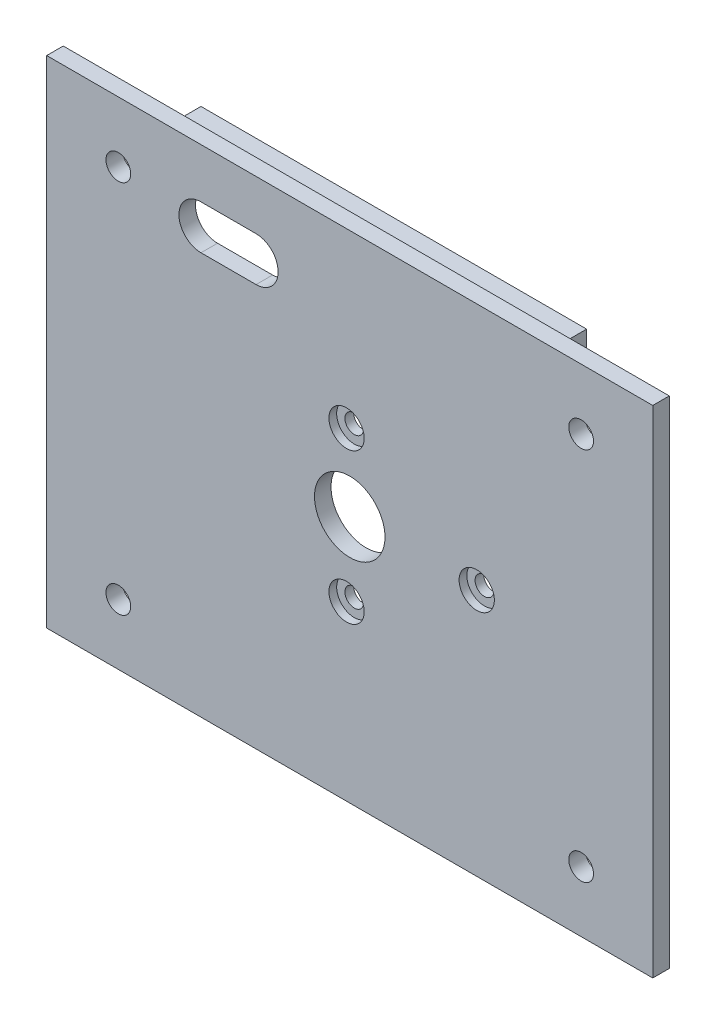
ISO-10303-21;
HEADER;
FILE_DESCRIPTION(('STEP AP214'),'2;1');
FILE_NAME('part.step','',(''),(''),'','','');
FILE_SCHEMA(('AUTOMOTIVE_DESIGN { 1 0 10303 214 1 1 1 1 }'));
ENDSEC;
DATA;
#1=APPLICATION_CONTEXT('core data for automotive mechanical design processes');
#2=APPLICATION_PROTOCOL_DEFINITION('international standard','automotive_design',2000,#1);
#3=PRODUCT_CONTEXT('',#1,'mechanical');
#4=PRODUCT('Part','Part','',(#3));
#5=PRODUCT_RELATED_PRODUCT_CATEGORY('part','',(#4));
#6=PRODUCT_DEFINITION_FORMATION('','',#4);
#7=PRODUCT_DEFINITION_CONTEXT('part definition',#1,'design');
#8=PRODUCT_DEFINITION('design','',#6,#7);
#9=PRODUCT_DEFINITION_SHAPE('','',#8);
#10=(LENGTH_UNIT() NAMED_UNIT(*) SI_UNIT(.MILLI.,.METRE.));
#11=(NAMED_UNIT(*) PLANE_ANGLE_UNIT() SI_UNIT($,.RADIAN.));
#12=(NAMED_UNIT(*) SI_UNIT($,.STERADIAN.) SOLID_ANGLE_UNIT());
#13=UNCERTAINTY_MEASURE_WITH_UNIT(LENGTH_MEASURE(1.E-05),#10,'distance_accuracy_value','');
#14=(GEOMETRIC_REPRESENTATION_CONTEXT(3) GLOBAL_UNCERTAINTY_ASSIGNED_CONTEXT((#13)) GLOBAL_UNIT_ASSIGNED_CONTEXT((#10,
#11,#12)) REPRESENTATION_CONTEXT('',''));
#15=CARTESIAN_POINT('',(0.,0.,0.));
#16=DIRECTION('',(0.,0.,1.));
#17=DIRECTION('',(1.,0.,0.));
#18=AXIS2_PLACEMENT_3D('',#15,#16,#17);
#19=CARTESIAN_POINT('',(-35.,40.,89.));
#20=DIRECTION('',(0.,0.,1.));
#21=DIRECTION('',(1.,0.,0.));
#22=AXIS2_PLACEMENT_3D('',#19,#20,#21);
#23=PLANE('',#22);
#24=DIRECTION('',(1.,0.,0.));
#25=VECTOR('',#24,1.);
#26=CARTESIAN_POINT('',(-35.,43.,89.));
#27=LINE('',#26,#25);
#28=CARTESIAN_POINT('',(-35.,43.,89.));
#29=VERTEX_POINT('',#28);
#30=CARTESIAN_POINT('',(35.,43.,89.));
#31=VERTEX_POINT('',#30);
#32=EDGE_CURVE('E174',#29,#31,#27,.T.);
#33=ORIENTED_EDGE('',*,*,#32,.T.);
#34=DIRECTION('',(0.,1.,0.));
#35=VECTOR('',#34,1.);
#36=CARTESIAN_POINT('',(35.,40.,89.));
#37=LINE('',#36,#35);
#38=CARTESIAN_POINT('',(35.,40.,89.));
#39=VERTEX_POINT('',#38);
#40=EDGE_CURVE('E11',#39,#31,#37,.T.);
#41=ORIENTED_EDGE('',*,*,#40,.F.);
#42=DIRECTION('',(1.,0.,0.));
#43=VECTOR('',#42,1.);
#44=CARTESIAN_POINT('',(-35.,40.,89.));
#45=LINE('',#44,#43);
#46=CARTESIAN_POINT('',(-35.,40.,89.));
#47=VERTEX_POINT('',#46);
#48=EDGE_CURVE('E20',#47,#39,#45,.T.);
#49=ORIENTED_EDGE('',*,*,#48,.F.);
#50=DIRECTION('',(0.,1.,0.));
#51=VECTOR('',#50,1.);
#52=CARTESIAN_POINT('',(-35.,40.,89.));
#53=LINE('',#52,#51);
#54=EDGE_CURVE('E186',#47,#29,#53,.T.);
#55=ORIENTED_EDGE('',*,*,#54,.T.);
#56=EDGE_LOOP('',(#33,#41,#49,#55));
#57=FACE_BOUND('',#56,.T.);
#58=ADVANCED_FACE('F17',(#57),#23,.F.);
#59=CARTESIAN_POINT('',(-35.,-43.,89.));
#60=DIRECTION('',(0.,0.,1.));
#61=DIRECTION('',(1.,0.,0.));
#62=AXIS2_PLACEMENT_3D('',#59,#60,#61);
#63=PLANE('',#62);
#64=DIRECTION('',(1.,0.,0.));
#65=VECTOR('',#64,1.);
#66=CARTESIAN_POINT('',(-35.,-40.,89.));
#67=LINE('',#66,#65);
#68=CARTESIAN_POINT('',(-35.,-40.,89.));
#69=VERTEX_POINT('',#68);
#70=CARTESIAN_POINT('',(35.,-40.,89.));
#71=VERTEX_POINT('',#70);
#72=EDGE_CURVE('E339',#69,#71,#67,.T.);
#73=ORIENTED_EDGE('',*,*,#72,.T.);
#74=DIRECTION('',(0.,1.,0.));
#75=VECTOR('',#74,1.);
#76=CARTESIAN_POINT('',(35.,-43.,89.));
#77=LINE('',#76,#75);
#78=CARTESIAN_POINT('',(35.,-43.,89.));
#79=VERTEX_POINT('',#78);
#80=EDGE_CURVE('E221',#79,#71,#77,.T.);
#81=ORIENTED_EDGE('',*,*,#80,.F.);
#82=DIRECTION('',(1.,0.,0.));
#83=VECTOR('',#82,1.);
#84=CARTESIAN_POINT('',(-35.,-43.,89.));
#85=LINE('',#84,#83);
#86=CARTESIAN_POINT('',(-35.,-43.,89.));
#87=VERTEX_POINT('',#86);
#88=EDGE_CURVE('E224',#87,#79,#85,.T.);
#89=ORIENTED_EDGE('',*,*,#88,.F.);
#90=DIRECTION('',(0.,1.,0.));
#91=VECTOR('',#90,1.);
#92=CARTESIAN_POINT('',(-35.,-43.,89.));
#93=LINE('',#92,#91);
#94=EDGE_CURVE('E317',#87,#69,#93,.T.);
#95=ORIENTED_EDGE('',*,*,#94,.T.);
#96=EDGE_LOOP('',(#73,#81,#89,#95));
#97=FACE_BOUND('',#96,.T.);
#98=ADVANCED_FACE('F561',(#97),#63,.F.);
#99=CARTESIAN_POINT('',(23.05,0.,95.6));
#100=DIRECTION('',(0.,0.,1.));
#101=DIRECTION('',(1.,0.,0.));
#102=AXIS2_PLACEMENT_3D('',#99,#100,#101);
#103=PLANE('',#102);
#104=CARTESIAN_POINT('',(23.05,0.,95.6));
#105=DIRECTION('',(0.,0.,1.));
#106=DIRECTION('',(1.,0.,0.));
#107=AXIS2_PLACEMENT_3D('',#104,#105,#106);
#108=CIRCLE('',#107,1.7);
#109=CARTESIAN_POINT('',(24.75,0.,95.6));
#110=VERTEX_POINT('',#109);
#111=EDGE_CURVE('E196',#110,#110,#108,.T.);
#112=ORIENTED_EDGE('',*,*,#111,.F.);
#113=EDGE_LOOP('',(#112));
#114=FACE_BOUND('',#113,.T.);
#115=CARTESIAN_POINT('',(23.05,0.,95.6));
#116=DIRECTION('',(0.,0.,1.));
#117=DIRECTION('',(1.,0.,0.));
#118=AXIS2_PLACEMENT_3D('',#115,#116,#117);
#119=CIRCLE('',#118,3.2);
#120=CARTESIAN_POINT('',(26.25,0.,95.6));
#121=VERTEX_POINT('',#120);
#122=EDGE_CURVE('E368',#121,#121,#119,.T.);
#123=ORIENTED_EDGE('',*,*,#122,.T.);
#124=EDGE_LOOP('',(#123));
#125=FACE_BOUND('',#124,.T.);
#126=ADVANCED_FACE('F464',(#114,#125),#103,.T.);
#127=CARTESIAN_POINT('',(-0.575,13.6399,95.6));
#128=DIRECTION('',(0.,0.,1.));
#129=DIRECTION('',(1.,0.,0.));
#130=AXIS2_PLACEMENT_3D('',#127,#128,#129);
#131=PLANE('',#130);
#132=CARTESIAN_POINT('',(-0.575,13.6399,95.6));
#133=DIRECTION('',(0.,0.,1.));
#134=DIRECTION('',(1.,0.,0.));
#135=AXIS2_PLACEMENT_3D('',#132,#133,#134);
#136=CIRCLE('',#135,1.7);
#137=CARTESIAN_POINT('',(1.125,13.6399,95.6));
#138=VERTEX_POINT('',#137);
#139=EDGE_CURVE('E405',#138,#138,#136,.T.);
#140=ORIENTED_EDGE('',*,*,#139,.F.);
#141=EDGE_LOOP('',(#140));
#142=FACE_BOUND('',#141,.T.);
#143=CARTESIAN_POINT('',(-0.575,13.6399,95.6));
#144=DIRECTION('',(0.,0.,1.));
#145=DIRECTION('',(1.,0.,0.));
#146=AXIS2_PLACEMENT_3D('',#143,#144,#145);
#147=CIRCLE('',#146,3.2);
#148=CARTESIAN_POINT('',(2.625,13.6399,95.6));
#149=VERTEX_POINT('',#148);
#150=EDGE_CURVE('E276',#149,#149,#147,.T.);
#151=ORIENTED_EDGE('',*,*,#150,.T.);
#152=EDGE_LOOP('',(#151));
#153=FACE_BOUND('',#152,.T.);
#154=ADVANCED_FACE('F460',(#142,#153),#131,.T.);
#155=CARTESIAN_POINT('',(-0.575,-13.6399,95.6));
#156=DIRECTION('',(0.,0.,1.));
#157=DIRECTION('',(1.,0.,0.));
#158=AXIS2_PLACEMENT_3D('',#155,#156,#157);
#159=PLANE('',#158);
#160=CARTESIAN_POINT('',(-0.575,-13.6399,95.6));
#161=DIRECTION('',(0.,0.,1.));
#162=DIRECTION('',(1.,0.,0.));
#163=AXIS2_PLACEMENT_3D('',#160,#161,#162);
#164=CIRCLE('',#163,1.7);
#165=CARTESIAN_POINT('',(1.125,-13.6399,95.6));
#166=VERTEX_POINT('',#165);
#167=EDGE_CURVE('E304',#166,#166,#164,.T.);
#168=ORIENTED_EDGE('',*,*,#167,.F.);
#169=EDGE_LOOP('',(#168));
#170=FACE_BOUND('',#169,.T.);
#171=CARTESIAN_POINT('',(-0.575,-13.6399,95.6));
#172=DIRECTION('',(0.,0.,1.));
#173=DIRECTION('',(1.,0.,0.));
#174=AXIS2_PLACEMENT_3D('',#171,#172,#173);
#175=CIRCLE('',#174,3.2);
#176=CARTESIAN_POINT('',(2.625,-13.6399,95.6));
#177=VERTEX_POINT('',#176);
#178=EDGE_CURVE('E417',#177,#177,#175,.T.);
#179=ORIENTED_EDGE('',*,*,#178,.T.);
#180=EDGE_LOOP('',(#179));
#181=FACE_BOUND('',#180,.T.);
#182=ADVANCED_FACE('F463',(#170,#181),#159,.T.);
#183=CARTESIAN_POINT('',(35.,40.,89.));
#184=DIRECTION('',(1.,0.,0.));
#185=DIRECTION('',(0.,1.,0.));
#186=AXIS2_PLACEMENT_3D('',#183,#184,#185);
#187=PLANE('',#186);
#188=DIRECTION('',(0.,0.,1.));
#189=VECTOR('',#188,1.);
#190=CARTESIAN_POINT('',(35.,40.,89.));
#191=LINE('',#190,#189);
#192=CARTESIAN_POINT('',(35.,40.,94.));
#193=VERTEX_POINT('',#192);
#194=EDGE_CURVE('E205',#39,#193,#191,.T.);
#195=ORIENTED_EDGE('',*,*,#194,.F.);
#196=ORIENTED_EDGE('',*,*,#40,.T.);
#197=DIRECTION('',(0.,0.,1.));
#198=VECTOR('',#197,1.);
#199=CARTESIAN_POINT('',(35.,43.,89.));
#200=LINE('',#199,#198);
#201=CARTESIAN_POINT('',(35.,43.,94.));
#202=VERTEX_POINT('',#201);
#203=EDGE_CURVE('E181',#31,#202,#200,.T.);
#204=ORIENTED_EDGE('',*,*,#203,.T.);
#205=DIRECTION('',(0.,1.,0.));
#206=VECTOR('',#205,1.);
#207=CARTESIAN_POINT('',(35.,40.,94.));
#208=LINE('',#207,#206);
#209=EDGE_CURVE('E349',#193,#202,#208,.T.);
#210=ORIENTED_EDGE('',*,*,#209,.F.);
#211=EDGE_LOOP('',(#195,#196,#204,#210));
#212=FACE_BOUND('',#211,.T.);
#213=ADVANCED_FACE('F655',(#212),#187,.T.);
#214=CARTESIAN_POINT('',(-35.,40.,89.));
#215=DIRECTION('',(0.,1.,0.));
#216=DIRECTION('',(1.,0.,0.));
#217=AXIS2_PLACEMENT_3D('',#214,#215,#216);
#218=PLANE('',#217);
#219=ORIENTED_EDGE('',*,*,#194,.T.);
#220=DIRECTION('',(1.,0.,0.));
#221=VECTOR('',#220,1.);
#222=CARTESIAN_POINT('',(-35.,40.,94.));
#223=LINE('',#222,#221);
#224=CARTESIAN_POINT('',(-35.,40.,94.));
#225=VERTEX_POINT('',#224);
#226=EDGE_CURVE('E354',#225,#193,#223,.T.);
#227=ORIENTED_EDGE('',*,*,#226,.F.);
#228=DIRECTION('',(0.,0.,1.));
#229=VECTOR('',#228,1.);
#230=CARTESIAN_POINT('',(-35.,40.,89.));
#231=LINE('',#230,#229);
#232=EDGE_CURVE('E183',#47,#225,#231,.T.);
#233=ORIENTED_EDGE('',*,*,#232,.F.);
#234=ORIENTED_EDGE('',*,*,#48,.T.);
#235=EDGE_LOOP('',(#219,#227,#233,#234));
#236=FACE_BOUND('',#235,.T.);
#237=ADVANCED_FACE('F659',(#236),#218,.F.);
#238=CARTESIAN_POINT('',(-35.,43.,89.));
#239=DIRECTION('',(0.,1.,0.));
#240=DIRECTION('',(1.,0.,0.));
#241=AXIS2_PLACEMENT_3D('',#238,#239,#240);
#242=PLANE('',#241);
#243=ORIENTED_EDGE('',*,*,#32,.F.);
#244=DIRECTION('',(0.,0.,1.));
#245=VECTOR('',#244,1.);
#246=CARTESIAN_POINT('',(-35.,43.,89.));
#247=LINE('',#246,#245);
#248=CARTESIAN_POINT('',(-35.,43.,94.));
#249=VERTEX_POINT('',#248);
#250=EDGE_CURVE('E179',#29,#249,#247,.T.);
#251=ORIENTED_EDGE('',*,*,#250,.T.);
#252=DIRECTION('',(1.,0.,0.));
#253=VECTOR('',#252,1.);
#254=CARTESIAN_POINT('',(-35.,43.,94.));
#255=LINE('',#254,#253);
#256=EDGE_CURVE('E353',#249,#202,#255,.T.);
#257=ORIENTED_EDGE('',*,*,#256,.T.);
#258=ORIENTED_EDGE('',*,*,#203,.F.);
#259=EDGE_LOOP('',(#243,#251,#257,#258));
#260=FACE_BOUND('',#259,.T.);
#261=ADVANCED_FACE('F176',(#260),#242,.T.);
#262=CARTESIAN_POINT('',(-35.,40.,89.));
#263=DIRECTION('',(1.,0.,0.));
#264=DIRECTION('',(0.,1.,0.));
#265=AXIS2_PLACEMENT_3D('',#262,#263,#264);
#266=PLANE('',#265);
#267=DIRECTION('',(0.,1.,0.));
#268=VECTOR('',#267,1.);
#269=CARTESIAN_POINT('',(-35.,40.,94.));
#270=LINE('',#269,#268);
#271=EDGE_CURVE('E193',#225,#249,#270,.T.);
#272=ORIENTED_EDGE('',*,*,#271,.T.);
#273=ORIENTED_EDGE('',*,*,#250,.F.);
#274=ORIENTED_EDGE('',*,*,#54,.F.);
#275=ORIENTED_EDGE('',*,*,#232,.T.);
#276=EDGE_LOOP('',(#272,#273,#274,#275));
#277=FACE_BOUND('',#276,.T.);
#278=ADVANCED_FACE('F191',(#277),#266,.F.);
#279=CARTESIAN_POINT('',(23.05,0.,93.));
#280=DIRECTION('',(0.,0.,1.));
#281=DIRECTION('',(1.,0.,0.));
#282=AXIS2_PLACEMENT_3D('',#279,#280,#281);
#283=CYLINDRICAL_SURFACE('',#282,1.7);
#284=DIRECTION('',(0.,0.,1.));
#285=VECTOR('',#284,1.);
#286=CARTESIAN_POINT('',(24.75,0.,93.));
#287=LINE('',#286,#285);
#288=CARTESIAN_POINT('',(24.75,0.,94.));
#289=VERTEX_POINT('',#288);
#290=EDGE_CURVE('E200',#289,#110,#287,.T.);
#291=ORIENTED_EDGE('',*,*,#290,.F.);
#292=CARTESIAN_POINT('',(23.05,0.,94.));
#293=DIRECTION('',(0.,0.,1.));
#294=DIRECTION('',(1.,0.,0.));
#295=AXIS2_PLACEMENT_3D('',#292,#293,#294);
#296=CIRCLE('',#295,1.7);
#297=EDGE_CURVE('E390',#289,#289,#296,.T.);
#298=ORIENTED_EDGE('',*,*,#297,.F.);
#299=ORIENTED_EDGE('',*,*,#290,.T.);
#300=ORIENTED_EDGE('',*,*,#111,.T.);
#301=EDGE_LOOP('',(#291,#298,#299,#300));
#302=FACE_BOUND('',#301,.T.);
#303=ADVANCED_FACE('F662',(#302),#283,.F.);
#304=CARTESIAN_POINT('',(-0.575,13.6399,93.));
#305=DIRECTION('',(0.,0.,1.));
#306=DIRECTION('',(1.,0.,0.));
#307=AXIS2_PLACEMENT_3D('',#304,#305,#306);
#308=CYLINDRICAL_SURFACE('',#307,1.7);
#309=DIRECTION('',(0.,0.,1.));
#310=VECTOR('',#309,1.);
#311=CARTESIAN_POINT('',(1.125,13.6399,93.));
#312=LINE('',#311,#310);
#313=CARTESIAN_POINT('',(1.125,13.6399,94.));
#314=VERTEX_POINT('',#313);
#315=EDGE_CURVE('E223',#314,#138,#312,.T.);
#316=ORIENTED_EDGE('',*,*,#315,.F.);
#317=CARTESIAN_POINT('',(-0.575,13.6399,94.));
#318=DIRECTION('',(0.,0.,1.));
#319=DIRECTION('',(1.,0.,0.));
#320=AXIS2_PLACEMENT_3D('',#317,#318,#319);
#321=CIRCLE('',#320,1.7);
#322=EDGE_CURVE('E364',#314,#314,#321,.T.);
#323=ORIENTED_EDGE('',*,*,#322,.F.);
#324=ORIENTED_EDGE('',*,*,#315,.T.);
#325=ORIENTED_EDGE('',*,*,#139,.T.);
#326=EDGE_LOOP('',(#316,#323,#324,#325));
#327=FACE_BOUND('',#326,.T.);
#328=ADVANCED_FACE('F457',(#327),#308,.F.);
#329=CARTESIAN_POINT('',(35.,-43.,89.));
#330=DIRECTION('',(1.,0.,0.));
#331=DIRECTION('',(0.,1.,0.));
#332=AXIS2_PLACEMENT_3D('',#329,#330,#331);
#333=PLANE('',#332);
#334=DIRECTION('',(0.,0.,1.));
#335=VECTOR('',#334,1.);
#336=CARTESIAN_POINT('',(35.,-43.,89.));
#337=LINE('',#336,#335);
#338=CARTESIAN_POINT('',(35.,-43.,94.));
#339=VERTEX_POINT('',#338);
#340=EDGE_CURVE('E338',#79,#339,#337,.T.);
#341=ORIENTED_EDGE('',*,*,#340,.F.);
#342=ORIENTED_EDGE('',*,*,#80,.T.);
#343=DIRECTION('',(0.,0.,1.));
#344=VECTOR('',#343,1.);
#345=CARTESIAN_POINT('',(35.,-40.,89.));
#346=LINE('',#345,#344);
#347=CARTESIAN_POINT('',(35.,-40.,94.));
#348=VERTEX_POINT('',#347);
#349=EDGE_CURVE('E335',#71,#348,#346,.T.);
#350=ORIENTED_EDGE('',*,*,#349,.T.);
#351=DIRECTION('',(0.,1.,0.));
#352=VECTOR('',#351,1.);
#353=CARTESIAN_POINT('',(35.,-43.,94.));
#354=LINE('',#353,#352);
#355=EDGE_CURVE('E334',#339,#348,#354,.T.);
#356=ORIENTED_EDGE('',*,*,#355,.F.);
#357=EDGE_LOOP('',(#341,#342,#350,#356));
#358=FACE_BOUND('',#357,.T.);
#359=ADVANCED_FACE('F546',(#358),#333,.T.);
#360=CARTESIAN_POINT('',(-35.,-43.,89.));
#361=DIRECTION('',(0.,1.,0.));
#362=DIRECTION('',(1.,0.,0.));
#363=AXIS2_PLACEMENT_3D('',#360,#361,#362);
#364=PLANE('',#363);
#365=ORIENTED_EDGE('',*,*,#340,.T.);
#366=DIRECTION('',(1.,0.,0.));
#367=VECTOR('',#366,1.);
#368=CARTESIAN_POINT('',(-35.,-43.,94.));
#369=LINE('',#368,#367);
#370=CARTESIAN_POINT('',(-35.,-43.,94.));
#371=VERTEX_POINT('',#370);
#372=EDGE_CURVE('E326',#371,#339,#369,.T.);
#373=ORIENTED_EDGE('',*,*,#372,.F.);
#374=DIRECTION('',(0.,0.,1.));
#375=VECTOR('',#374,1.);
#376=CARTESIAN_POINT('',(-35.,-43.,89.));
#377=LINE('',#376,#375);
#378=EDGE_CURVE('E321',#87,#371,#377,.T.);
#379=ORIENTED_EDGE('',*,*,#378,.F.);
#380=ORIENTED_EDGE('',*,*,#88,.T.);
#381=EDGE_LOOP('',(#365,#373,#379,#380));
#382=FACE_BOUND('',#381,.T.);
#383=ADVANCED_FACE('F558',(#382),#364,.F.);
#384=CARTESIAN_POINT('',(-35.,-40.,89.));
#385=DIRECTION('',(0.,1.,0.));
#386=DIRECTION('',(1.,0.,0.));
#387=AXIS2_PLACEMENT_3D('',#384,#385,#386);
#388=PLANE('',#387);
#389=ORIENTED_EDGE('',*,*,#72,.F.);
#390=DIRECTION('',(0.,0.,1.));
#391=VECTOR('',#390,1.);
#392=CARTESIAN_POINT('',(-35.,-40.,89.));
#393=LINE('',#392,#391);
#394=CARTESIAN_POINT('',(-35.,-40.,94.));
#395=VERTEX_POINT('',#394);
#396=EDGE_CURVE('E322',#69,#395,#393,.T.);
#397=ORIENTED_EDGE('',*,*,#396,.T.);
#398=DIRECTION('',(1.,0.,0.));
#399=VECTOR('',#398,1.);
#400=CARTESIAN_POINT('',(-35.,-40.,94.));
#401=LINE('',#400,#399);
#402=EDGE_CURVE('E340',#395,#348,#401,.T.);
#403=ORIENTED_EDGE('',*,*,#402,.T.);
#404=ORIENTED_EDGE('',*,*,#349,.F.);
#405=EDGE_LOOP('',(#389,#397,#403,#404));
#406=FACE_BOUND('',#405,.T.);
#407=ADVANCED_FACE('F549',(#406),#388,.T.);
#408=CARTESIAN_POINT('',(-35.,-43.,89.));
#409=DIRECTION('',(1.,0.,0.));
#410=DIRECTION('',(0.,1.,0.));
#411=AXIS2_PLACEMENT_3D('',#408,#409,#410);
#412=PLANE('',#411);
#413=DIRECTION('',(0.,1.,0.));
#414=VECTOR('',#413,1.);
#415=CARTESIAN_POINT('',(-35.,-43.,94.));
#416=LINE('',#415,#414);
#417=EDGE_CURVE('E344',#371,#395,#416,.T.);
#418=ORIENTED_EDGE('',*,*,#417,.T.);
#419=ORIENTED_EDGE('',*,*,#396,.F.);
#420=ORIENTED_EDGE('',*,*,#94,.F.);
#421=ORIENTED_EDGE('',*,*,#378,.T.);
#422=EDGE_LOOP('',(#418,#419,#420,#421));
#423=FACE_BOUND('',#422,.T.);
#424=ADVANCED_FACE('F555',(#423),#412,.F.);
#425=CARTESIAN_POINT('',(-0.575,-13.6399,93.));
#426=DIRECTION('',(0.,0.,1.));
#427=DIRECTION('',(1.,0.,0.));
#428=AXIS2_PLACEMENT_3D('',#425,#426,#427);
#429=CYLINDRICAL_SURFACE('',#428,1.7);
#430=DIRECTION('',(0.,0.,1.));
#431=VECTOR('',#430,1.);
#432=CARTESIAN_POINT('',(1.125,-13.6399,93.));
#433=LINE('',#432,#431);
#434=CARTESIAN_POINT('',(1.125,-13.6399,94.));
#435=VERTEX_POINT('',#434);
#436=EDGE_CURVE('E300',#435,#166,#433,.T.);
#437=ORIENTED_EDGE('',*,*,#436,.F.);
#438=CARTESIAN_POINT('',(-0.575,-13.6399,94.));
#439=DIRECTION('',(0.,0.,1.));
#440=DIRECTION('',(1.,0.,0.));
#441=AXIS2_PLACEMENT_3D('',#438,#439,#440);
#442=CIRCLE('',#441,1.7);
#443=EDGE_CURVE('E316',#435,#435,#442,.T.);
#444=ORIENTED_EDGE('',*,*,#443,.F.);
#445=ORIENTED_EDGE('',*,*,#436,.T.);
#446=ORIENTED_EDGE('',*,*,#167,.T.);
#447=EDGE_LOOP('',(#437,#444,#445,#446));
#448=FACE_BOUND('',#447,.T.);
#449=ADVANCED_FACE('F674',(#448),#429,.F.);
#450=CARTESIAN_POINT('',(42.,34.,93.));
#451=DIRECTION('',(0.,0.,1.));
#452=DIRECTION('',(1.,0.,0.));
#453=AXIS2_PLACEMENT_3D('',#450,#451,#452);
#454=CYLINDRICAL_SURFACE('',#453,2.25);
#455=DIRECTION('',(0.,0.,1.));
#456=VECTOR('',#455,1.);
#457=CARTESIAN_POINT('',(44.25,34.,93.));
#458=LINE('',#457,#456);
#459=CARTESIAN_POINT('',(44.25,34.,94.));
#460=VERTEX_POINT('',#459);
#461=CARTESIAN_POINT('',(44.25,34.,97.));
#462=VERTEX_POINT('',#461);
#463=EDGE_CURVE('E305',#460,#462,#458,.T.);
#464=ORIENTED_EDGE('',*,*,#463,.F.);
#465=CARTESIAN_POINT('',(42.,34.,94.));
#466=DIRECTION('',(0.,0.,1.));
#467=DIRECTION('',(1.,0.,0.));
#468=AXIS2_PLACEMENT_3D('',#465,#466,#467);
#469=CIRCLE('',#468,2.25);
#470=EDGE_CURVE('E408',#460,#460,#469,.T.);
#471=ORIENTED_EDGE('',*,*,#470,.F.);
#472=ORIENTED_EDGE('',*,*,#463,.T.);
#473=CARTESIAN_POINT('',(42.,34.,97.));
#474=DIRECTION('',(0.,0.,1.));
#475=DIRECTION('',(1.,0.,0.));
#476=AXIS2_PLACEMENT_3D('',#473,#474,#475);
#477=CIRCLE('',#476,2.25);
#478=EDGE_CURVE('E231',#462,#462,#477,.T.);
#479=ORIENTED_EDGE('',*,*,#478,.T.);
#480=EDGE_LOOP('',(#464,#471,#472,#479));
#481=FACE_BOUND('',#480,.T.);
#482=ADVANCED_FACE('F677',(#481),#454,.F.);
#483=CARTESIAN_POINT('',(23.05,0.,95.6));
#484=DIRECTION('',(0.,0.,1.));
#485=DIRECTION('',(1.,0.,0.));
#486=AXIS2_PLACEMENT_3D('',#483,#484,#485);
#487=CYLINDRICAL_SURFACE('',#486,3.2);
#488=DIRECTION('',(0.,0.,1.));
#489=VECTOR('',#488,1.);
#490=CARTESIAN_POINT('',(26.25,0.,95.6));
#491=LINE('',#490,#489);
#492=CARTESIAN_POINT('',(26.25,0.,97.));
#493=VERTEX_POINT('',#492);
#494=EDGE_CURVE('E371',#121,#493,#491,.T.);
#495=ORIENTED_EDGE('',*,*,#494,.F.);
#496=ORIENTED_EDGE('',*,*,#122,.F.);
#497=ORIENTED_EDGE('',*,*,#494,.T.);
#498=CARTESIAN_POINT('',(23.05,0.,97.));
#499=DIRECTION('',(0.,0.,1.));
#500=DIRECTION('',(1.,0.,0.));
#501=AXIS2_PLACEMENT_3D('',#498,#499,#500);
#502=CIRCLE('',#501,3.2);
#503=EDGE_CURVE('E236',#493,#493,#502,.T.);
#504=ORIENTED_EDGE('',*,*,#503,.T.);
#505=EDGE_LOOP('',(#495,#496,#497,#504));
#506=FACE_BOUND('',#505,.T.);
#507=ADVANCED_FACE('F681',(#506),#487,.F.);
#508=CARTESIAN_POINT('',(0.,0.,93.));
#509=DIRECTION('',(0.,0.,1.));
#510=DIRECTION('',(1.,0.,0.));
#511=AXIS2_PLACEMENT_3D('',#508,#509,#510);
#512=CYLINDRICAL_SURFACE('',#511,6.4);
#513=DIRECTION('',(0.,0.,1.));
#514=VECTOR('',#513,1.);
#515=CARTESIAN_POINT('',(6.4,0.,93.));
#516=LINE('',#515,#514);
#517=CARTESIAN_POINT('',(6.4,0.,94.));
#518=VERTEX_POINT('',#517);
#519=CARTESIAN_POINT('',(6.4,0.,97.));
#520=VERTEX_POINT('',#519);
#521=EDGE_CURVE('E245',#518,#520,#516,.T.);
#522=ORIENTED_EDGE('',*,*,#521,.F.);
#523=CARTESIAN_POINT('',(0.,0.,94.));
#524=DIRECTION('',(0.,0.,1.));
#525=DIRECTION('',(1.,0.,0.));
#526=AXIS2_PLACEMENT_3D('',#523,#524,#525);
#527=CIRCLE('',#526,6.4);
#528=EDGE_CURVE('E386',#518,#518,#527,.T.);
#529=ORIENTED_EDGE('',*,*,#528,.F.);
#530=ORIENTED_EDGE('',*,*,#521,.T.);
#531=CARTESIAN_POINT('',(0.,0.,97.));
#532=DIRECTION('',(0.,0.,1.));
#533=DIRECTION('',(1.,0.,0.));
#534=AXIS2_PLACEMENT_3D('',#531,#532,#533);
#535=CIRCLE('',#534,6.4);
#536=EDGE_CURVE('E289',#520,#520,#535,.T.);
#537=ORIENTED_EDGE('',*,*,#536,.T.);
#538=EDGE_LOOP('',(#522,#529,#530,#537));
#539=FACE_BOUND('',#538,.T.);
#540=ADVANCED_FACE('F686',(#539),#512,.F.);
#541=CARTESIAN_POINT('',(-17.,32.,92.));
#542=DIRECTION('',(0.,0.,-1.));
#543=DIRECTION('',(0.,1.,0.));
#544=AXIS2_PLACEMENT_3D('',#541,#542,#543);
#545=CYLINDRICAL_SURFACE('',#544,4.);
#546=DIRECTION('',(0.,0.,1.));
#547=VECTOR('',#546,1.);
#548=CARTESIAN_POINT('',(-17.,28.,92.));
#549=LINE('',#548,#547);
#550=CARTESIAN_POINT('',(-17.,28.,94.));
#551=VERTEX_POINT('',#550);
#552=CARTESIAN_POINT('',(-17.,28.,97.));
#553=VERTEX_POINT('',#552);
#554=EDGE_CURVE('E241',#551,#553,#549,.T.);
#555=ORIENTED_EDGE('',*,*,#554,.T.);
#556=CARTESIAN_POINT('',(-17.,32.,97.));
#557=DIRECTION('',(0.,0.,-1.));
#558=DIRECTION('',(0.,1.,0.));
#559=AXIS2_PLACEMENT_3D('',#556,#557,#558);
#560=CIRCLE('',#559,4.);
#561=CARTESIAN_POINT('',(-17.,36.,97.));
#562=VERTEX_POINT('',#561);
#563=EDGE_CURVE('E271',#562,#553,#560,.T.);
#564=ORIENTED_EDGE('',*,*,#563,.F.);
#565=DIRECTION('',(0.,0.,1.));
#566=VECTOR('',#565,1.);
#567=CARTESIAN_POINT('',(-17.,36.,92.));
#568=LINE('',#567,#566);
#569=CARTESIAN_POINT('',(-17.,36.,94.));
#570=VERTEX_POINT('',#569);
#571=EDGE_CURVE('E428',#570,#562,#568,.T.);
#572=ORIENTED_EDGE('',*,*,#571,.F.);
#573=CARTESIAN_POINT('',(-17.,32.,94.));
#574=DIRECTION('',(0.,0.,-1.));
#575=DIRECTION('',(0.,1.,0.));
#576=AXIS2_PLACEMENT_3D('',#573,#574,#575);
#577=CIRCLE('',#576,4.);
#578=EDGE_CURVE('E378',#570,#551,#577,.T.);
#579=ORIENTED_EDGE('',*,*,#578,.T.);
#580=EDGE_LOOP('',(#555,#564,#572,#579));
#581=FACE_BOUND('',#580,.T.);
#582=ADVANCED_FACE('F614',(#581),#545,.F.);
#583=CARTESIAN_POINT('',(-17.,28.,92.));
#584=DIRECTION('',(0.,-1.,0.));
#585=DIRECTION('',(0.,0.,-1.));
#586=AXIS2_PLACEMENT_3D('',#583,#584,#585);
#587=PLANE('',#586);
#588=DIRECTION('',(0.,0.,1.));
#589=VECTOR('',#588,1.);
#590=CARTESIAN_POINT('',(-27.,28.,92.));
#591=LINE('',#590,#589);
#592=CARTESIAN_POINT('',(-27.,28.,94.));
#593=VERTEX_POINT('',#592);
#594=CARTESIAN_POINT('',(-27.,28.,97.));
#595=VERTEX_POINT('',#594);
#596=EDGE_CURVE('E246',#593,#595,#591,.T.);
#597=ORIENTED_EDGE('',*,*,#596,.T.);
#598=DIRECTION('',(1.,0.,0.));
#599=VECTOR('',#598,1.);
#600=CARTESIAN_POINT('',(-36.,28.,97.));
#601=LINE('',#600,#599);
#602=EDGE_CURVE('E281',#595,#553,#601,.T.);
#603=ORIENTED_EDGE('',*,*,#602,.T.);
#604=ORIENTED_EDGE('',*,*,#554,.F.);
#605=DIRECTION('',(1.,0.,0.));
#606=VECTOR('',#605,1.);
#607=CARTESIAN_POINT('',(-36.,28.,94.));
#608=LINE('',#607,#606);
#609=EDGE_CURVE('E359',#593,#551,#608,.T.);
#610=ORIENTED_EDGE('',*,*,#609,.F.);
#611=EDGE_LOOP('',(#597,#603,#604,#610));
#612=FACE_BOUND('',#611,.T.);
#613=ADVANCED_FACE('F620',(#612),#587,.F.);
#614=CARTESIAN_POINT('',(-27.,32.,92.));
#615=DIRECTION('',(0.,0.,-1.));
#616=DIRECTION('',(0.,-1.,0.));
#617=AXIS2_PLACEMENT_3D('',#614,#615,#616);
#618=CYLINDRICAL_SURFACE('',#617,4.);
#619=DIRECTION('',(0.,0.,1.));
#620=VECTOR('',#619,1.);
#621=CARTESIAN_POINT('',(-27.,36.,92.));
#622=LINE('',#621,#620);
#623=CARTESIAN_POINT('',(-27.,36.,94.));
#624=VERTEX_POINT('',#623);
#625=CARTESIAN_POINT('',(-27.,36.,97.));
#626=VERTEX_POINT('',#625);
#627=EDGE_CURVE('E330',#624,#626,#622,.T.);
#628=ORIENTED_EDGE('',*,*,#627,.T.);
#629=CARTESIAN_POINT('',(-27.,32.,97.));
#630=DIRECTION('',(0.,0.,-1.));
#631=DIRECTION('',(0.,-1.,0.));
#632=AXIS2_PLACEMENT_3D('',#629,#630,#631);
#633=CIRCLE('',#632,4.);
#634=EDGE_CURVE('E285',#595,#626,#633,.T.);
#635=ORIENTED_EDGE('',*,*,#634,.F.);
#636=ORIENTED_EDGE('',*,*,#596,.F.);
#637=CARTESIAN_POINT('',(-27.,32.,94.));
#638=DIRECTION('',(0.,0.,-1.));
#639=DIRECTION('',(0.,-1.,0.));
#640=AXIS2_PLACEMENT_3D('',#637,#638,#639);
#641=CIRCLE('',#640,4.);
#642=EDGE_CURVE('E355',#593,#624,#641,.T.);
#643=ORIENTED_EDGE('',*,*,#642,.T.);
#644=EDGE_LOOP('',(#628,#635,#636,#643));
#645=FACE_BOUND('',#644,.T.);
#646=ADVANCED_FACE('F631',(#645),#618,.F.);
#647=CARTESIAN_POINT('',(-27.,36.,92.));
#648=DIRECTION('',(0.,1.,0.));
#649=DIRECTION('',(1.,0.,0.));
#650=AXIS2_PLACEMENT_3D('',#647,#648,#649);
#651=PLANE('',#650);
#652=ORIENTED_EDGE('',*,*,#571,.T.);
#653=DIRECTION('',(-1.,0.,0.));
#654=VECTOR('',#653,1.);
#655=CARTESIAN_POINT('',(-41.,36.,97.));
#656=LINE('',#655,#654);
#657=EDGE_CURVE('E267',#562,#626,#656,.T.);
#658=ORIENTED_EDGE('',*,*,#657,.T.);
#659=ORIENTED_EDGE('',*,*,#627,.F.);
#660=DIRECTION('',(-1.,0.,0.));
#661=VECTOR('',#660,1.);
#662=CARTESIAN_POINT('',(-41.,36.,94.));
#663=LINE('',#662,#661);
#664=EDGE_CURVE('E382',#570,#624,#663,.T.);
#665=ORIENTED_EDGE('',*,*,#664,.F.);
#666=EDGE_LOOP('',(#652,#658,#659,#665));
#667=FACE_BOUND('',#666,.T.);
#668=ADVANCED_FACE('F625',(#667),#651,.F.);
#669=CARTESIAN_POINT('',(-42.,34.,93.));
#670=DIRECTION('',(0.,0.,1.));
#671=DIRECTION('',(1.,0.,0.));
#672=AXIS2_PLACEMENT_3D('',#669,#670,#671);
#673=CYLINDRICAL_SURFACE('',#672,2.25);
#674=DIRECTION('',(0.,0.,1.));
#675=VECTOR('',#674,1.);
#676=CARTESIAN_POINT('',(-39.75,34.,93.));
#677=LINE('',#676,#675);
#678=CARTESIAN_POINT('',(-39.75,34.,94.));
#679=VERTEX_POINT('',#678);
#680=CARTESIAN_POINT('',(-39.75,34.,97.));
#681=VERTEX_POINT('',#680);
#682=EDGE_CURVE('E422',#679,#681,#677,.T.);
#683=ORIENTED_EDGE('',*,*,#682,.F.);
#684=CARTESIAN_POINT('',(-42.,34.,94.));
#685=DIRECTION('',(0.,0.,1.));
#686=DIRECTION('',(1.,0.,0.));
#687=AXIS2_PLACEMENT_3D('',#684,#685,#686);
#688=CIRCLE('',#687,2.25);
#689=EDGE_CURVE('E360',#679,#679,#688,.T.);
#690=ORIENTED_EDGE('',*,*,#689,.F.);
#691=ORIENTED_EDGE('',*,*,#682,.T.);
#692=CARTESIAN_POINT('',(-42.,34.,97.));
#693=DIRECTION('',(0.,0.,1.));
#694=DIRECTION('',(1.,0.,0.));
#695=AXIS2_PLACEMENT_3D('',#692,#693,#694);
#696=CIRCLE('',#695,2.25);
#697=EDGE_CURVE('E263',#681,#681,#696,.T.);
#698=ORIENTED_EDGE('',*,*,#697,.T.);
#699=EDGE_LOOP('',(#683,#690,#691,#698));
#700=FACE_BOUND('',#699,.T.);
#701=ADVANCED_FACE('F639',(#700),#673,.F.);
#702=CARTESIAN_POINT('',(-0.575,13.6399,95.6));
#703=DIRECTION('',(0.,0.,1.));
#704=DIRECTION('',(1.,0.,0.));
#705=AXIS2_PLACEMENT_3D('',#702,#703,#704);
#706=CYLINDRICAL_SURFACE('',#705,3.2);
#707=DIRECTION('',(0.,0.,1.));
#708=VECTOR('',#707,1.);
#709=CARTESIAN_POINT('',(2.625,13.6399,95.6));
#710=LINE('',#709,#708);
#711=CARTESIAN_POINT('',(2.625,13.6399,97.));
#712=VERTEX_POINT('',#711);
#713=EDGE_CURVE('E272',#149,#712,#710,.T.);
#714=ORIENTED_EDGE('',*,*,#713,.F.);
#715=ORIENTED_EDGE('',*,*,#150,.F.);
#716=ORIENTED_EDGE('',*,*,#713,.T.);
#717=CARTESIAN_POINT('',(-0.575,13.6399,97.));
#718=DIRECTION('',(0.,0.,1.));
#719=DIRECTION('',(1.,0.,0.));
#720=AXIS2_PLACEMENT_3D('',#717,#718,#719);
#721=CIRCLE('',#720,3.2);
#722=EDGE_CURVE('E259',#712,#712,#721,.T.);
#723=ORIENTED_EDGE('',*,*,#722,.T.);
#724=EDGE_LOOP('',(#714,#715,#716,#723));
#725=FACE_BOUND('',#724,.T.);
#726=ADVANCED_FACE('F469',(#725),#706,.F.);
#727=CARTESIAN_POINT('',(42.,-34.,93.));
#728=DIRECTION('',(0.,0.,1.));
#729=DIRECTION('',(1.,0.,0.));
#730=AXIS2_PLACEMENT_3D('',#727,#728,#729);
#731=CYLINDRICAL_SURFACE('',#730,2.25);
#732=DIRECTION('',(0.,0.,1.));
#733=VECTOR('',#732,1.);
#734=CARTESIAN_POINT('',(44.25,-34.,93.));
#735=LINE('',#734,#733);
#736=CARTESIAN_POINT('',(44.25,-34.,94.));
#737=VERTEX_POINT('',#736);
#738=CARTESIAN_POINT('',(44.25,-34.,97.));
#739=VERTEX_POINT('',#738);
#740=EDGE_CURVE('E277',#737,#739,#735,.T.);
#741=ORIENTED_EDGE('',*,*,#740,.F.);
#742=CARTESIAN_POINT('',(42.,-34.,94.));
#743=DIRECTION('',(0.,0.,1.));
#744=DIRECTION('',(1.,0.,0.));
#745=AXIS2_PLACEMENT_3D('',#742,#743,#744);
#746=CIRCLE('',#745,2.25);
#747=EDGE_CURVE('E348',#737,#737,#746,.T.);
#748=ORIENTED_EDGE('',*,*,#747,.F.);
#749=ORIENTED_EDGE('',*,*,#740,.T.);
#750=CARTESIAN_POINT('',(42.,-34.,97.));
#751=DIRECTION('',(0.,0.,1.));
#752=DIRECTION('',(1.,0.,0.));
#753=AXIS2_PLACEMENT_3D('',#750,#751,#752);
#754=CIRCLE('',#753,2.25);
#755=EDGE_CURVE('E258',#739,#739,#754,.T.);
#756=ORIENTED_EDGE('',*,*,#755,.T.);
#757=EDGE_LOOP('',(#741,#748,#749,#756));
#758=FACE_BOUND('',#757,.T.);
#759=ADVANCED_FACE('F703',(#758),#731,.F.);
#760=CARTESIAN_POINT('',(-0.575,-13.6399,95.6));
#761=DIRECTION('',(0.,0.,1.));
#762=DIRECTION('',(1.,0.,0.));
#763=AXIS2_PLACEMENT_3D('',#760,#761,#762);
#764=CYLINDRICAL_SURFACE('',#763,3.2);
#765=DIRECTION('',(0.,0.,1.));
#766=VECTOR('',#765,1.);
#767=CARTESIAN_POINT('',(2.625,-13.6399,95.6));
#768=LINE('',#767,#766);
#769=CARTESIAN_POINT('',(2.625,-13.6399,97.));
#770=VERTEX_POINT('',#769);
#771=EDGE_CURVE('E412',#177,#770,#768,.T.);
#772=ORIENTED_EDGE('',*,*,#771,.F.);
#773=ORIENTED_EDGE('',*,*,#178,.F.);
#774=ORIENTED_EDGE('',*,*,#771,.T.);
#775=CARTESIAN_POINT('',(-0.575,-13.6399,97.));
#776=DIRECTION('',(0.,0.,1.));
#777=DIRECTION('',(1.,0.,0.));
#778=AXIS2_PLACEMENT_3D('',#775,#776,#777);
#779=CIRCLE('',#778,3.2);
#780=EDGE_CURVE('E254',#770,#770,#779,.T.);
#781=ORIENTED_EDGE('',*,*,#780,.T.);
#782=EDGE_LOOP('',(#772,#773,#774,#781));
#783=FACE_BOUND('',#782,.T.);
#784=ADVANCED_FACE('F708',(#783),#764,.F.);
#785=CARTESIAN_POINT('',(-42.,-34.,93.));
#786=DIRECTION('',(0.,0.,1.));
#787=DIRECTION('',(1.,0.,0.));
#788=AXIS2_PLACEMENT_3D('',#785,#786,#787);
#789=CYLINDRICAL_SURFACE('',#788,2.25);
#790=DIRECTION('',(0.,0.,1.));
#791=VECTOR('',#790,1.);
#792=CARTESIAN_POINT('',(-39.75,-34.,93.));
#793=LINE('',#792,#791);
#794=CARTESIAN_POINT('',(-39.75,-34.,94.));
#795=VERTEX_POINT('',#794);
#796=CARTESIAN_POINT('',(-39.75,-34.,97.));
#797=VERTEX_POINT('',#796);
#798=EDGE_CURVE('E409',#795,#797,#793,.T.);
#799=ORIENTED_EDGE('',*,*,#798,.F.);
#800=CARTESIAN_POINT('',(-42.,-34.,94.));
#801=DIRECTION('',(0.,0.,1.));
#802=DIRECTION('',(1.,0.,0.));
#803=AXIS2_PLACEMENT_3D('',#800,#801,#802);
#804=CIRCLE('',#803,2.25);
#805=EDGE_CURVE('E312',#795,#795,#804,.T.);
#806=ORIENTED_EDGE('',*,*,#805,.F.);
#807=ORIENTED_EDGE('',*,*,#798,.T.);
#808=CARTESIAN_POINT('',(-42.,-34.,97.));
#809=DIRECTION('',(0.,0.,1.));
#810=DIRECTION('',(1.,0.,0.));
#811=AXIS2_PLACEMENT_3D('',#808,#809,#810);
#812=CIRCLE('',#811,2.25);
#813=EDGE_CURVE('E250',#797,#797,#812,.T.);
#814=ORIENTED_EDGE('',*,*,#813,.T.);
#815=EDGE_LOOP('',(#799,#806,#807,#814));
#816=FACE_BOUND('',#815,.T.);
#817=ADVANCED_FACE('F711',(#816),#789,.F.);
#818=CARTESIAN_POINT('',(55.,-45.,94.));
#819=DIRECTION('',(1.,0.,0.));
#820=DIRECTION('',(0.,1.,0.));
#821=AXIS2_PLACEMENT_3D('',#818,#819,#820);
#822=PLANE('',#821);
#823=DIRECTION('',(0.,0.,1.));
#824=VECTOR('',#823,1.);
#825=CARTESIAN_POINT('',(55.,-45.,94.));
#826=LINE('',#825,#824);
#827=CARTESIAN_POINT('',(55.,-45.,94.));
#828=VERTEX_POINT('',#827);
#829=CARTESIAN_POINT('',(55.,-45.,97.));
#830=VERTEX_POINT('',#829);
#831=EDGE_CURVE('E219',#828,#830,#826,.T.);
#832=ORIENTED_EDGE('',*,*,#831,.F.);
#833=DIRECTION('',(0.,1.,0.));
#834=VECTOR('',#833,1.);
#835=CARTESIAN_POINT('',(55.,-45.,94.));
#836=LINE('',#835,#834);
#837=CARTESIAN_POINT('',(55.,45.,94.));
#838=VERTEX_POINT('',#837);
#839=EDGE_CURVE('E309',#828,#838,#836,.T.);
#840=ORIENTED_EDGE('',*,*,#839,.T.);
#841=DIRECTION('',(0.,0.,1.));
#842=VECTOR('',#841,1.);
#843=CARTESIAN_POINT('',(55.,45.,94.));
#844=LINE('',#843,#842);
#845=CARTESIAN_POINT('',(55.,45.,97.));
#846=VERTEX_POINT('',#845);
#847=EDGE_CURVE('E299',#838,#846,#844,.T.);
#848=ORIENTED_EDGE('',*,*,#847,.T.);
#849=DIRECTION('',(0.,1.,0.));
#850=VECTOR('',#849,1.);
#851=CARTESIAN_POINT('',(55.,-45.,97.));
#852=LINE('',#851,#850);
#853=EDGE_CURVE('E229',#830,#846,#852,.T.);
#854=ORIENTED_EDGE('',*,*,#853,.F.);
#855=EDGE_LOOP('',(#832,#840,#848,#854));
#856=FACE_BOUND('',#855,.T.);
#857=ADVANCED_FACE('F714',(#856),#822,.T.);
#858=CARTESIAN_POINT('',(-55.,-45.,94.));
#859=DIRECTION('',(0.,0.,1.));
#860=DIRECTION('',(1.,0.,0.));
#861=AXIS2_PLACEMENT_3D('',#858,#859,#860);
#862=PLANE('',#861);
#863=ORIENTED_EDGE('',*,*,#470,.T.);
#864=EDGE_LOOP('',(#863));
#865=FACE_BOUND('',#864,.T.);
#866=ORIENTED_EDGE('',*,*,#226,.T.);
#867=ORIENTED_EDGE('',*,*,#209,.T.);
#868=ORIENTED_EDGE('',*,*,#256,.F.);
#869=ORIENTED_EDGE('',*,*,#271,.F.);
#870=EDGE_LOOP('',(#866,#867,#868,#869));
#871=FACE_BOUND('',#870,.T.);
#872=ORIENTED_EDGE('',*,*,#297,.T.);
#873=EDGE_LOOP('',(#872));
#874=FACE_BOUND('',#873,.T.);
#875=ORIENTED_EDGE('',*,*,#528,.T.);
#876=EDGE_LOOP('',(#875));
#877=FACE_BOUND('',#876,.T.);
#878=ORIENTED_EDGE('',*,*,#642,.F.);
#879=ORIENTED_EDGE('',*,*,#609,.T.);
#880=ORIENTED_EDGE('',*,*,#578,.F.);
#881=ORIENTED_EDGE('',*,*,#664,.T.);
#882=EDGE_LOOP('',(#878,#879,#880,#881));
#883=FACE_BOUND('',#882,.T.);
#884=ORIENTED_EDGE('',*,*,#689,.T.);
#885=EDGE_LOOP('',(#884));
#886=FACE_BOUND('',#885,.T.);
#887=ORIENTED_EDGE('',*,*,#322,.T.);
#888=EDGE_LOOP('',(#887));
#889=FACE_BOUND('',#888,.T.);
#890=ORIENTED_EDGE('',*,*,#747,.T.);
#891=EDGE_LOOP('',(#890));
#892=FACE_BOUND('',#891,.T.);
#893=ORIENTED_EDGE('',*,*,#372,.T.);
#894=ORIENTED_EDGE('',*,*,#355,.T.);
#895=ORIENTED_EDGE('',*,*,#402,.F.);
#896=ORIENTED_EDGE('',*,*,#417,.F.);
#897=EDGE_LOOP('',(#893,#894,#895,#896));
#898=FACE_BOUND('',#897,.T.);
#899=ORIENTED_EDGE('',*,*,#443,.T.);
#900=EDGE_LOOP('',(#899));
#901=FACE_BOUND('',#900,.T.);
#902=ORIENTED_EDGE('',*,*,#805,.T.);
#903=EDGE_LOOP('',(#902));
#904=FACE_BOUND('',#903,.T.);
#905=DIRECTION('',(1.,0.,0.));
#906=VECTOR('',#905,1.);
#907=CARTESIAN_POINT('',(-55.,45.,94.));
#908=LINE('',#907,#906);
#909=CARTESIAN_POINT('',(-55.,45.,94.));
#910=VERTEX_POINT('',#909);
#911=EDGE_CURVE('E235',#910,#838,#908,.T.);
#912=ORIENTED_EDGE('',*,*,#911,.T.);
#913=ORIENTED_EDGE('',*,*,#839,.F.);
#914=DIRECTION('',(1.,0.,0.));
#915=VECTOR('',#914,1.);
#916=CARTESIAN_POINT('',(-55.,-45.,94.));
#917=LINE('',#916,#915);
#918=CARTESIAN_POINT('',(-55.,-45.,94.));
#919=VERTEX_POINT('',#918);
#920=EDGE_CURVE('E225',#919,#828,#917,.T.);
#921=ORIENTED_EDGE('',*,*,#920,.F.);
#922=DIRECTION('',(0.,1.,0.));
#923=VECTOR('',#922,1.);
#924=CARTESIAN_POINT('',(-55.,-45.,94.));
#925=LINE('',#924,#923);
#926=EDGE_CURVE('E515',#919,#910,#925,.T.);
#927=ORIENTED_EDGE('',*,*,#926,.T.);
#928=EDGE_LOOP('',(#912,#913,#921,#927));
#929=FACE_BOUND('',#928,.T.);
#930=ADVANCED_FACE('F540',(#865,#871,#874,#877,#883,#886,#889,#892,#898,#901,#904,#929),#862,.F.);
#931=CARTESIAN_POINT('',(-55.,45.,94.));
#932=DIRECTION('',(0.,1.,0.));
#933=DIRECTION('',(1.,0.,0.));
#934=AXIS2_PLACEMENT_3D('',#931,#932,#933);
#935=PLANE('',#934);
#936=ORIENTED_EDGE('',*,*,#911,.F.);
#937=DIRECTION('',(0.,0.,1.));
#938=VECTOR('',#937,1.);
#939=CARTESIAN_POINT('',(-55.,45.,94.));
#940=LINE('',#939,#938);
#941=CARTESIAN_POINT('',(-55.,45.,97.));
#942=VERTEX_POINT('',#941);
#943=EDGE_CURVE('E510',#910,#942,#940,.T.);
#944=ORIENTED_EDGE('',*,*,#943,.T.);
#945=DIRECTION('',(1.,0.,0.));
#946=VECTOR('',#945,1.);
#947=CARTESIAN_POINT('',(-55.,45.,97.));
#948=LINE('',#947,#946);
#949=EDGE_CURVE('E240',#942,#846,#948,.T.);
#950=ORIENTED_EDGE('',*,*,#949,.T.);
#951=ORIENTED_EDGE('',*,*,#847,.F.);
#952=EDGE_LOOP('',(#936,#944,#950,#951));
#953=FACE_BOUND('',#952,.T.);
#954=ADVANCED_FACE('F481',(#953),#935,.T.);
#955=CARTESIAN_POINT('',(-55.,-45.,97.));
#956=DIRECTION('',(0.,0.,1.));
#957=DIRECTION('',(1.,0.,0.));
#958=AXIS2_PLACEMENT_3D('',#955,#956,#957);
#959=PLANE('',#958);
#960=ORIENTED_EDGE('',*,*,#478,.F.);
#961=EDGE_LOOP('',(#960));
#962=FACE_BOUND('',#961,.T.);
#963=ORIENTED_EDGE('',*,*,#503,.F.);
#964=EDGE_LOOP('',(#963));
#965=FACE_BOUND('',#964,.T.);
#966=ORIENTED_EDGE('',*,*,#536,.F.);
#967=EDGE_LOOP('',(#966));
#968=FACE_BOUND('',#967,.T.);
#969=ORIENTED_EDGE('',*,*,#657,.F.);
#970=ORIENTED_EDGE('',*,*,#563,.T.);
#971=ORIENTED_EDGE('',*,*,#602,.F.);
#972=ORIENTED_EDGE('',*,*,#634,.T.);
#973=EDGE_LOOP('',(#969,#970,#971,#972));
#974=FACE_BOUND('',#973,.T.);
#975=ORIENTED_EDGE('',*,*,#697,.F.);
#976=EDGE_LOOP('',(#975));
#977=FACE_BOUND('',#976,.T.);
#978=ORIENTED_EDGE('',*,*,#722,.F.);
#979=EDGE_LOOP('',(#978));
#980=FACE_BOUND('',#979,.T.);
#981=ORIENTED_EDGE('',*,*,#755,.F.);
#982=EDGE_LOOP('',(#981));
#983=FACE_BOUND('',#982,.T.);
#984=ORIENTED_EDGE('',*,*,#780,.F.);
#985=EDGE_LOOP('',(#984));
#986=FACE_BOUND('',#985,.T.);
#987=ORIENTED_EDGE('',*,*,#813,.F.);
#988=EDGE_LOOP('',(#987));
#989=FACE_BOUND('',#988,.T.);
#990=DIRECTION('',(0.,1.,0.));
#991=VECTOR('',#990,1.);
#992=CARTESIAN_POINT('',(-55.,-45.,97.));
#993=LINE('',#992,#991);
#994=CARTESIAN_POINT('',(-55.,-45.,97.));
#995=VERTEX_POINT('',#994);
#996=EDGE_CURVE('E498',#995,#942,#993,.T.);
#997=ORIENTED_EDGE('',*,*,#996,.F.);
#998=DIRECTION('',(1.,0.,0.));
#999=VECTOR('',#998,1.);
#1000=CARTESIAN_POINT('',(-55.,-45.,97.));
#1001=LINE('',#1000,#999);
#1002=EDGE_CURVE('E230',#995,#830,#1001,.T.);
#1003=ORIENTED_EDGE('',*,*,#1002,.T.);
#1004=ORIENTED_EDGE('',*,*,#853,.T.);
#1005=ORIENTED_EDGE('',*,*,#949,.F.);
#1006=EDGE_LOOP('',(#997,#1003,#1004,#1005));
#1007=FACE_BOUND('',#1006,.T.);
#1008=ADVANCED_FACE('F477',(#962,#965,#968,#974,#977,#980,#983,#986,#989,#1007),#959,.T.);
#1009=CARTESIAN_POINT('',(-55.,-45.,94.));
#1010=DIRECTION('',(0.,1.,0.));
#1011=DIRECTION('',(1.,0.,0.));
#1012=AXIS2_PLACEMENT_3D('',#1009,#1010,#1011);
#1013=PLANE('',#1012);
#1014=ORIENTED_EDGE('',*,*,#831,.T.);
#1015=ORIENTED_EDGE('',*,*,#1002,.F.);
#1016=DIRECTION('',(0.,0.,1.));
#1017=VECTOR('',#1016,1.);
#1018=CARTESIAN_POINT('',(-55.,-45.,94.));
#1019=LINE('',#1018,#1017);
#1020=EDGE_CURVE('E524',#919,#995,#1019,.T.);
#1021=ORIENTED_EDGE('',*,*,#1020,.F.);
#1022=ORIENTED_EDGE('',*,*,#920,.T.);
#1023=EDGE_LOOP('',(#1014,#1015,#1021,#1022));
#1024=FACE_BOUND('',#1023,.T.);
#1025=ADVANCED_FACE('F480',(#1024),#1013,.F.);
#1026=CARTESIAN_POINT('',(-55.,-45.,94.));
#1027=DIRECTION('',(1.,0.,0.));
#1028=DIRECTION('',(0.,1.,0.));
#1029=AXIS2_PLACEMENT_3D('',#1026,#1027,#1028);
#1030=PLANE('',#1029);
#1031=ORIENTED_EDGE('',*,*,#996,.T.);
#1032=ORIENTED_EDGE('',*,*,#943,.F.);
#1033=ORIENTED_EDGE('',*,*,#926,.F.);
#1034=ORIENTED_EDGE('',*,*,#1020,.T.);
#1035=EDGE_LOOP('',(#1031,#1032,#1033,#1034));
#1036=FACE_BOUND('',#1035,.T.);
#1037=ADVANCED_FACE('F698',(#1036),#1030,.F.);
#1038=CLOSED_SHELL('',(#58,#98,#126,#154,#182,#213,#237,#261,#278,#303,#328,#359,#383,#407,#424,
#449,#482,#507,#540,#582,#613,#646,#668,#701,#726,#759,#784,#817,#857,#930,#954,#1008,#1025,#1037));
#1039=MANIFOLD_SOLID_BREP('B1',#1038);
#1040=ADVANCED_BREP_SHAPE_REPRESENTATION('',(#18,#1039),#14);
#1041=SHAPE_DEFINITION_REPRESENTATION(#9,#1040);
ENDSEC;
END-ISO-10303-21;
